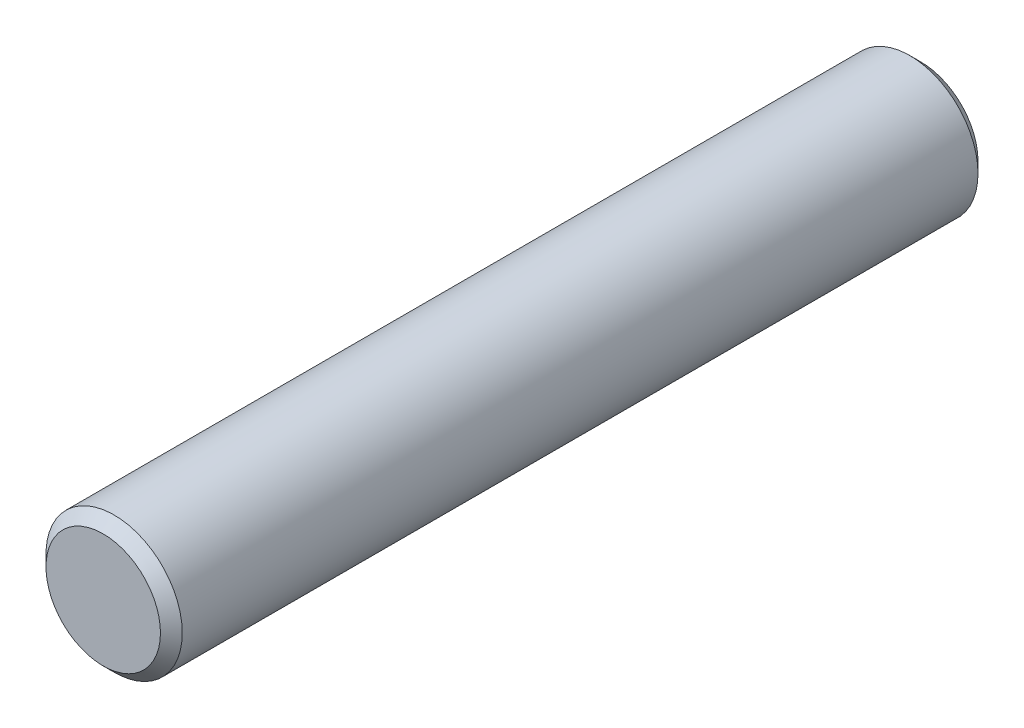
ISO-10303-21;
HEADER;
FILE_DESCRIPTION(('STEP AP214'),'2;1');
FILE_NAME('part.step','',(''),(''),'','','');
FILE_SCHEMA(('AUTOMOTIVE_DESIGN { 1 0 10303 214 1 1 1 1 }'));
ENDSEC;
DATA;
#1=APPLICATION_CONTEXT('core data for automotive mechanical design processes');
#2=APPLICATION_PROTOCOL_DEFINITION('international standard','automotive_design',2000,#1);
#3=PRODUCT_CONTEXT('',#1,'mechanical');
#4=PRODUCT('Part','Part','',(#3));
#5=PRODUCT_RELATED_PRODUCT_CATEGORY('part','',(#4));
#6=PRODUCT_DEFINITION_FORMATION('','',#4);
#7=PRODUCT_DEFINITION_CONTEXT('part definition',#1,'design');
#8=PRODUCT_DEFINITION('design','',#6,#7);
#9=PRODUCT_DEFINITION_SHAPE('','',#8);
#10=(LENGTH_UNIT() NAMED_UNIT(*) SI_UNIT(.MILLI.,.METRE.));
#11=(NAMED_UNIT(*) PLANE_ANGLE_UNIT() SI_UNIT($,.RADIAN.));
#12=(NAMED_UNIT(*) SI_UNIT($,.STERADIAN.) SOLID_ANGLE_UNIT());
#13=UNCERTAINTY_MEASURE_WITH_UNIT(LENGTH_MEASURE(1.E-05),#10,'distance_accuracy_value','');
#14=(GEOMETRIC_REPRESENTATION_CONTEXT(3) GLOBAL_UNCERTAINTY_ASSIGNED_CONTEXT((#13)) GLOBAL_UNIT_ASSIGNED_CONTEXT((#10,
#11,#12)) REPRESENTATION_CONTEXT('',''));
#15=CARTESIAN_POINT('',(0.,0.,0.));
#16=DIRECTION('',(0.,0.,1.));
#17=DIRECTION('',(1.,0.,0.));
#18=AXIS2_PLACEMENT_3D('',#15,#16,#17);
#19=CARTESIAN_POINT('',(0.,0.,30.));
#20=DIRECTION('',(0.,0.,-1.));
#21=DIRECTION('',(-1.,0.,0.));
#22=AXIS2_PLACEMENT_3D('',#19,#20,#21);
#23=CYLINDRICAL_SURFACE('',#22,2.5);
#24=CARTESIAN_POINT('',(0.,0.,0.400000000000001));
#25=DIRECTION('',(0.,0.,1.));
#26=DIRECTION('',(1.,0.,0.));
#27=AXIS2_PLACEMENT_3D('',#24,#25,#26);
#28=CIRCLE('',#27,2.5);
#29=CARTESIAN_POINT('',(2.5,0.,0.400000000000001));
#30=VERTEX_POINT('',#29);
#31=EDGE_CURVE('E63',#30,#30,#28,.T.);
#32=ORIENTED_EDGE('',*,*,#31,.T.);
#33=EDGE_LOOP('',(#32));
#34=FACE_BOUND('',#33,.T.);
#35=CARTESIAN_POINT('',(0.,0.,29.6));
#36=DIRECTION('',(0.,0.,1.));
#37=DIRECTION('',(1.,0.,0.));
#38=AXIS2_PLACEMENT_3D('',#35,#36,#37);
#39=CIRCLE('',#38,2.5);
#40=CARTESIAN_POINT('',(2.5,0.,29.6));
#41=VERTEX_POINT('',#40);
#42=EDGE_CURVE('E68',#41,#41,#39,.F.);
#43=ORIENTED_EDGE('',*,*,#42,.T.);
#44=EDGE_LOOP('',(#43));
#45=FACE_BOUND('',#44,.T.);
#46=ADVANCED_FACE('F49',(#34,#45),#23,.T.);
#47=CARTESIAN_POINT('',(0.,0.,30.));
#48=DIRECTION('',(0.,0.,1.));
#49=DIRECTION('',(1.,0.,0.));
#50=AXIS2_PLACEMENT_3D('',#47,#48,#49);
#51=PLANE('',#50);
#52=CARTESIAN_POINT('',(0.,0.,30.));
#53=DIRECTION('',(0.,0.,1.));
#54=DIRECTION('',(1.,0.,0.));
#55=AXIS2_PLACEMENT_3D('',#52,#53,#54);
#56=CIRCLE('',#55,2.09999999999999);
#57=CARTESIAN_POINT('',(2.09999999999999,0.,30.));
#58=VERTEX_POINT('',#57);
#59=EDGE_CURVE('E10',#58,#58,#56,.T.);
#60=ORIENTED_EDGE('',*,*,#59,.T.);
#61=EDGE_LOOP('',(#60));
#62=FACE_BOUND('',#61,.T.);
#63=ADVANCED_FACE('F85',(#62),#51,.T.);
#64=CARTESIAN_POINT('',(0.,0.,0.));
#65=DIRECTION('',(0.,0.,1.));
#66=DIRECTION('',(1.,0.,0.));
#67=AXIS2_PLACEMENT_3D('',#64,#65,#66);
#68=PLANE('',#67);
#69=CARTESIAN_POINT('',(0.,0.,0.));
#70=DIRECTION('',(0.,0.,1.));
#71=DIRECTION('',(1.,0.,0.));
#72=AXIS2_PLACEMENT_3D('',#69,#70,#71);
#73=CIRCLE('',#72,2.1);
#74=CARTESIAN_POINT('',(2.1,0.,0.));
#75=VERTEX_POINT('',#74);
#76=EDGE_CURVE('E58',#75,#75,#73,.F.);
#77=ORIENTED_EDGE('',*,*,#76,.T.);
#78=EDGE_LOOP('',(#77));
#79=FACE_BOUND('',#78,.T.);
#80=ADVANCED_FACE('F82',(#79),#68,.F.);
#81=CARTESIAN_POINT('',(0.,0.,0.400000000000001));
#82=DIRECTION('',(0.,0.,1.));
#83=DIRECTION('',(1.,0.,0.));
#84=AXIS2_PLACEMENT_3D('',#81,#82,#83);
#85=CONICAL_SURFACE('',#84,2.5,0.78539816339745);
#86=ORIENTED_EDGE('',*,*,#76,.F.);
#87=EDGE_LOOP('',(#86));
#88=FACE_BOUND('',#87,.T.);
#89=ORIENTED_EDGE('',*,*,#31,.F.);
#90=EDGE_LOOP('',(#89));
#91=FACE_BOUND('',#90,.T.);
#92=ADVANCED_FACE('F78',(#88,#91),#85,.T.);
#93=CARTESIAN_POINT('',(0.,0.,30.));
#94=DIRECTION('',(0.,0.,-1.));
#95=DIRECTION('',(-1.,0.,0.));
#96=AXIS2_PLACEMENT_3D('',#93,#94,#95);
#97=CONICAL_SURFACE('',#96,2.09999999999999,0.78539816339745);
#98=ORIENTED_EDGE('',*,*,#42,.F.);
#99=EDGE_LOOP('',(#98));
#100=FACE_BOUND('',#99,.T.);
#101=ORIENTED_EDGE('',*,*,#59,.F.);
#102=EDGE_LOOP('',(#101));
#103=FACE_BOUND('',#102,.T.);
#104=ADVANCED_FACE('F52',(#100,#103),#97,.T.);
#105=CLOSED_SHELL('',(#46,#63,#80,#92,#104));
#106=MANIFOLD_SOLID_BREP('B2',#105);
#107=ADVANCED_BREP_SHAPE_REPRESENTATION('',(#18,#106),#14);
#108=SHAPE_DEFINITION_REPRESENTATION(#9,#107);
ENDSEC;
END-ISO-10303-21;
